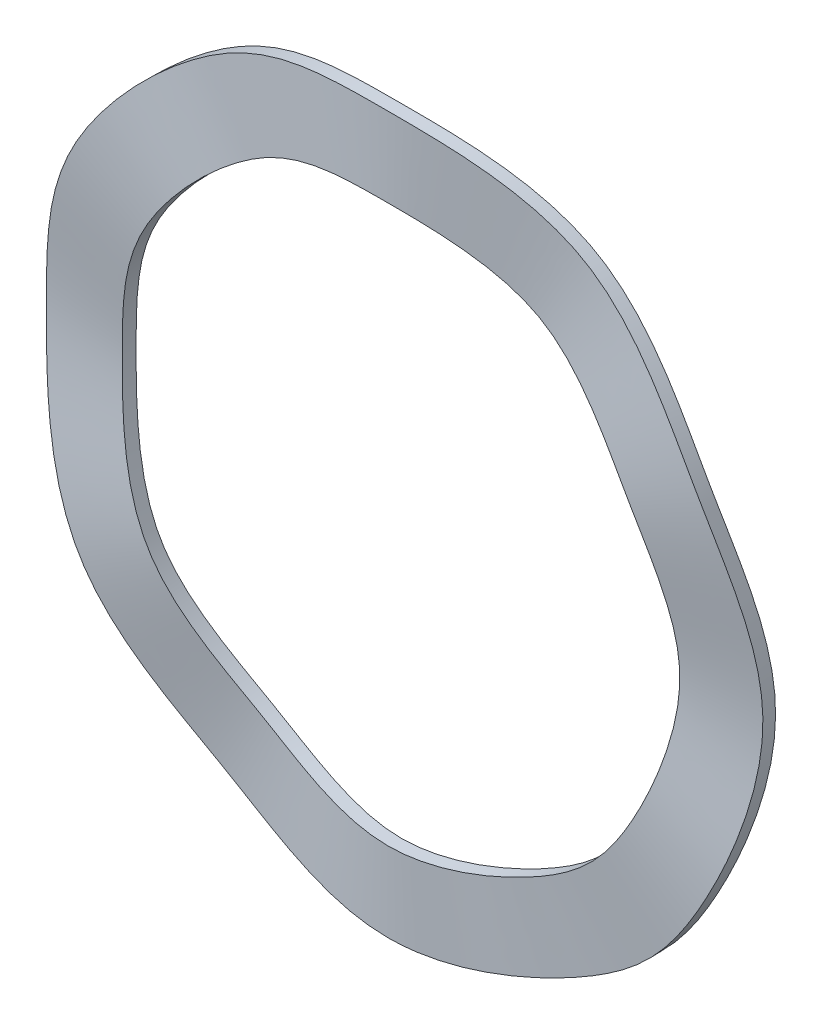
ISO-10303-21;
HEADER;
FILE_DESCRIPTION(('STEP AP214'),'2;1');
FILE_NAME('part.step','',(''),(''),'','','');
FILE_SCHEMA(('AUTOMOTIVE_DESIGN { 1 0 10303 214 1 1 1 1 }'));
ENDSEC;
DATA;
#1=APPLICATION_CONTEXT('core data for automotive mechanical design processes');
#2=APPLICATION_PROTOCOL_DEFINITION('international standard','automotive_design',2000,#1);
#3=PRODUCT_CONTEXT('',#1,'mechanical');
#4=PRODUCT('Part','Part','',(#3));
#5=PRODUCT_RELATED_PRODUCT_CATEGORY('part','',(#4));
#6=PRODUCT_DEFINITION_FORMATION('','',#4);
#7=PRODUCT_DEFINITION_CONTEXT('part definition',#1,'design');
#8=PRODUCT_DEFINITION('design','',#6,#7);
#9=PRODUCT_DEFINITION_SHAPE('','',#8);
#10=(LENGTH_UNIT() NAMED_UNIT(*) SI_UNIT(.MILLI.,.METRE.));
#11=(NAMED_UNIT(*) PLANE_ANGLE_UNIT() SI_UNIT($,.RADIAN.));
#12=(NAMED_UNIT(*) SI_UNIT($,.STERADIAN.) SOLID_ANGLE_UNIT());
#13=UNCERTAINTY_MEASURE_WITH_UNIT(LENGTH_MEASURE(1.E-05),#10,'distance_accuracy_value','');
#14=(GEOMETRIC_REPRESENTATION_CONTEXT(3) GLOBAL_UNCERTAINTY_ASSIGNED_CONTEXT((#13)) GLOBAL_UNIT_ASSIGNED_CONTEXT((#10,
#11,#12)) REPRESENTATION_CONTEXT('',''));
#15=CARTESIAN_POINT('',(0.,0.,0.));
#16=DIRECTION('',(0.,0.,1.));
#17=DIRECTION('',(1.,0.,0.));
#18=AXIS2_PLACEMENT_3D('',#15,#16,#17);
#19=CARTESIAN_POINT('',(0.,-13.5,0.350000000000003));
#20=CARTESIAN_POINT('',(-2.31317289138842,-13.5,0.350000000000072));
#21=CARTESIAN_POINT('',(-4.66289318457445,-12.882724188606,-0.272301408901748));
#22=CARTESIAN_POINT('',(-8.82531983480047,-10.4795460642622,-0.272301373732881));
#23=CARTESIAN_POINT('',(-10.5347690255698,-8.75329584756202,0.350051052372541));
#24=CARTESIAN_POINT('',(-12.8479611023498,-4.74672968618007,0.350051095639847));
#25=CARTESIAN_POINT('',(-13.4882408331322,-2.40317431504147,-0.272251517641625));
#26=CARTESIAN_POINT('',(-13.488240829194,2.4031743150418,-0.272251524719741));
#27=CARTESIAN_POINT('',(-12.8479611007759,4.74672968527651,0.35005109201583));
#28=CARTESIAN_POINT('',(-10.5347690271433,8.75329584846629,0.350051055996531));
#29=CARTESIAN_POINT('',(-8.82531983578861,10.4795460659718,-0.272301370196654));
#30=CARTESIAN_POINT('',(-4.66289318358569,12.8827241868967,-0.272301412437975));
#31=CARTESIAN_POINT('',(-2.31317849028789,13.4999999981824,0.349999996378275));
#32=CARTESIAN_POINT('',(2.3131784902875,13.5000000018176,0.350000003621759));
#33=CARTESIAN_POINT('',(4.66289318457464,12.8827241886086,-0.272301408902137));
#34=CARTESIAN_POINT('',(8.82531983479983,10.4795460642598,-0.272301373732492));
#35=CARTESIAN_POINT('',(10.5347690255751,8.75329584755968,0.350051052374428));
#36=CARTESIAN_POINT('',(12.8479611023448,4.74672968618188,0.35005109563796));
#37=CARTESIAN_POINT('',(13.4882408331361,2.40317431503527,-0.272251517642486));
#38=CARTESIAN_POINT('',(13.48824082919,-2.40317431503662,-0.272251524718881));
#39=CARTESIAN_POINT('',(12.8479611007803,-4.74672968527711,0.350051092016329));
#40=CARTESIAN_POINT('',(10.5347690271385,-8.75329584846648,0.350051055996059));
#41=CARTESIAN_POINT('',(8.82531983578968,-10.4795460659696,-0.272301370194933));
#42=CARTESIAN_POINT('',(4.66289318358393,-12.8827241868993,-0.272301412439696));
#43=CARTESIAN_POINT('',(2.31317289138833,-13.5,0.349999999999934));
#44=CARTESIAN_POINT('',(0.,-13.5,0.350000000000003));
#45=CARTESIAN_POINT('',(0.,-10.5,0.350000000000003));
#46=CARTESIAN_POINT('',(-1.77727450652617,-10.5,0.350000000000045));
#47=CARTESIAN_POINT('',(-3.64871314917526,-10.0076863447894,-0.136965869132921));
#48=CARTESIAN_POINT('',(-6.84255403804092,-8.16372145924832,-0.136966049852583));
#49=CARTESIAN_POINT('',(-8.20466639914356,-6.78915201465728,0.349744745948899));
#50=CARTESIAN_POINT('',(-9.98191133317683,-3.71087353473544,0.349744529639706));
#51=CARTESIAN_POINT('',(-10.4912811917381,-1.84401258476975,-0.137222232478723));
#52=CARTESIAN_POINT('',(-10.4912811897553,1.84401258477,-0.137222196130909));
#53=CARTESIAN_POINT('',(-9.98191133159904,3.7108735338318,0.349744547749997));
#54=CARTESIAN_POINT('',(-8.20466640072104,6.78915201556146,0.349744727838608));
#55=CARTESIAN_POINT('',(-6.84255403853441,8.16372146011204,-0.136966068027405));
#56=CARTESIAN_POINT('',(-3.6487131486813,10.007686343926,-0.136965850958098));
#57=CARTESIAN_POINT('',(-1.77728538317083,10.4999999981804,0.350000018113));
#58=CARTESIAN_POINT('',(1.77728538317053,10.5000000018196,0.349999981887034));
#59=CARTESIAN_POINT('',(3.64871314918121,10.0076863447893,-0.13696586913417));
#60=CARTESIAN_POINT('',(6.84255403803462,8.1637214592486,-0.136966049851306));
#61=CARTESIAN_POINT('',(8.20466639914961,6.78915201465216,0.34974474595062));
#62=CARTESIAN_POINT('',(9.981911333171,3.71087353474016,0.349744529637985));
#63=CARTESIAN_POINT('',(10.4912811917421,1.84401258476812,-0.137222232479112));
#64=CARTESIAN_POINT('',(10.4912811897513,-1.84401258476917,-0.137222196130521));
#65=CARTESIAN_POINT('',(9.98191133160665,-3.71087353383022,0.349744547752384));
#66=CARTESIAN_POINT('',(8.20466640071307,-6.78915201556366,0.349744727836221));
#67=CARTESIAN_POINT('',(6.84255403853381,-8.16372146011046,-0.136966068026295));
#68=CARTESIAN_POINT('',(3.64871314868137,-10.0076863439278,-0.136965850959209));
#69=CARTESIAN_POINT('',(1.7772745065261,-10.5,0.349999999999961));
#70=CARTESIAN_POINT('',(0.,-10.5,0.350000000000003));
#71=B_SPLINE_SURFACE_WITH_KNOTS('',1,3,((#19,#20,#21,#22,#23,#24,#25,#26,#27,#28,#29,#30,#31,
#32,#33,#34,#35,#36,#37,#38,#39,#40,#41,#42,#43,#44),(#45,#46,#47,#48,#49,#50,#51,#52,#53,#54,
#55,#56,#57,#58,#59,#60,#61,#62,#63,#64,#65,#66,#67,#68,#69,#70)),.UNSPECIFIED.,.F.,.T.,.F.,(2,
2),(4,2,2,2,2,2,2,2,2,2,2,2,4),(0.,1.),(0.,0.0833333333333341,0.166666666666665,
0.249999999999998,0.33333333333333,0.416666666666663,0.499999999999992,0.583333333333328,
0.66666666666667,0.750000000000002,0.833333333333335,0.916666666666669,1.),.UNSPECIFIED.);
#72=CARTESIAN_POINT('',(0.,-13.5,0.350000000000003));
#73=CARTESIAN_POINT('',(-2.31317289138842,-13.5,0.350000000000072));
#74=CARTESIAN_POINT('',(-4.66289318457445,-12.882724188606,-0.272301408901748));
#75=CARTESIAN_POINT('',(-8.82531983480047,-10.4795460642622,-0.272301373732881));
#76=CARTESIAN_POINT('',(-10.5347690255698,-8.75329584756202,0.350051052372541));
#77=CARTESIAN_POINT('',(-12.8479611023498,-4.74672968618007,0.350051095639847));
#78=CARTESIAN_POINT('',(-13.4882408331322,-2.40317431504147,-0.272251517641625));
#79=CARTESIAN_POINT('',(-13.488240829194,2.4031743150418,-0.272251524719741));
#80=CARTESIAN_POINT('',(-12.8479611007759,4.74672968527651,0.35005109201583));
#81=CARTESIAN_POINT('',(-10.5347690271433,8.75329584846629,0.350051055996531));
#82=CARTESIAN_POINT('',(-8.82531983578861,10.4795460659718,-0.272301370196654));
#83=CARTESIAN_POINT('',(-4.66289318358569,12.8827241868967,-0.272301412437975));
#84=CARTESIAN_POINT('',(-2.31317849028789,13.4999999981824,0.349999996378275));
#85=CARTESIAN_POINT('',(2.3131784902875,13.5000000018176,0.350000003621759));
#86=CARTESIAN_POINT('',(4.66289318457464,12.8827241886086,-0.272301408902137));
#87=CARTESIAN_POINT('',(8.82531983479983,10.4795460642598,-0.272301373732492));
#88=CARTESIAN_POINT('',(10.5347690255751,8.75329584755968,0.350051052374428));
#89=CARTESIAN_POINT('',(12.8479611023448,4.74672968618188,0.35005109563796));
#90=CARTESIAN_POINT('',(13.4882408331361,2.40317431503527,-0.272251517642486));
#91=CARTESIAN_POINT('',(13.48824082919,-2.40317431503662,-0.272251524718881));
#92=CARTESIAN_POINT('',(12.8479611007803,-4.74672968527711,0.350051092016329));
#93=CARTESIAN_POINT('',(10.5347690271385,-8.75329584846648,0.350051055996059));
#94=CARTESIAN_POINT('',(8.82531983578968,-10.4795460659696,-0.272301370194933));
#95=CARTESIAN_POINT('',(4.66289318358393,-12.8827241868993,-0.272301412439696));
#96=CARTESIAN_POINT('',(2.31317289138833,-13.5,0.349999999999934));
#97=CARTESIAN_POINT('',(0.,-13.5,0.350000000000003));
#98=B_SPLINE_CURVE_WITH_KNOTS('',3,(#72,#73,#74,#75,#76,#77,#78,#79,#80,#81,#82,#83,#84,#85,#86,
#87,#88,#89,#90,#91,#92,#93,#94,#95,#96,#97),.UNSPECIFIED.,.T.,.F.,(4,2,2,2,2,2,2,2,2,2,2,2,4),
(0.,0.0833333333333341,0.166666666666665,0.249999999999998,0.33333333333333,0.416666666666663,
0.499999999999992,0.583333333333328,0.66666666666667,0.750000000000002,0.833333333333335,
0.916666666666669,1.),.UNSPECIFIED.);
#99=CARTESIAN_POINT('',(0.,-13.5,0.350000000000003));
#100=VERTEX_POINT('',#99);
#101=EDGE_CURVE('E21',#100,#100,#98,.T.);
#102=CARTESIAN_POINT('',(0.,-10.5,0.350000000000003));
#103=CARTESIAN_POINT('',(-1.77727450652617,-10.5,0.350000000000045));
#104=CARTESIAN_POINT('',(-3.64871314917526,-10.0076863447894,-0.136965869132921));
#105=CARTESIAN_POINT('',(-6.84255403804092,-8.16372145924832,-0.136966049852583));
#106=CARTESIAN_POINT('',(-8.20466639914356,-6.78915201465728,0.349744745948899));
#107=CARTESIAN_POINT('',(-9.98191133317683,-3.71087353473544,0.349744529639706));
#108=CARTESIAN_POINT('',(-10.4912811917381,-1.84401258476975,-0.137222232478723));
#109=CARTESIAN_POINT('',(-10.4912811897553,1.84401258477,-0.137222196130909));
#110=CARTESIAN_POINT('',(-9.98191133159904,3.7108735338318,0.349744547749997));
#111=CARTESIAN_POINT('',(-8.20466640072104,6.78915201556146,0.349744727838608));
#112=CARTESIAN_POINT('',(-6.84255403853441,8.16372146011204,-0.136966068027405));
#113=CARTESIAN_POINT('',(-3.6487131486813,10.007686343926,-0.136965850958098));
#114=CARTESIAN_POINT('',(-1.77728538317083,10.4999999981804,0.350000018113));
#115=CARTESIAN_POINT('',(1.77728538317053,10.5000000018196,0.349999981887034));
#116=CARTESIAN_POINT('',(3.64871314918121,10.0076863447893,-0.13696586913417));
#117=CARTESIAN_POINT('',(6.84255403803462,8.1637214592486,-0.136966049851306));
#118=CARTESIAN_POINT('',(8.20466639914961,6.78915201465216,0.34974474595062));
#119=CARTESIAN_POINT('',(9.981911333171,3.71087353474016,0.349744529637985));
#120=CARTESIAN_POINT('',(10.4912811917421,1.84401258476812,-0.137222232479112));
#121=CARTESIAN_POINT('',(10.4912811897513,-1.84401258476917,-0.137222196130521));
#122=CARTESIAN_POINT('',(9.98191133160665,-3.71087353383022,0.349744547752384));
#123=CARTESIAN_POINT('',(8.20466640071307,-6.78915201556366,0.349744727836221));
#124=CARTESIAN_POINT('',(6.84255403853381,-8.16372146011046,-0.136966068026295));
#125=CARTESIAN_POINT('',(3.64871314868137,-10.0076863439278,-0.136965850959209));
#126=CARTESIAN_POINT('',(1.7772745065261,-10.5,0.349999999999961));
#127=CARTESIAN_POINT('',(0.,-10.5,0.350000000000003));
#128=B_SPLINE_CURVE_WITH_KNOTS('',3,(#102,#103,#104,#105,#106,#107,#108,#109,#110,#111,#112,
#113,#114,#115,#116,#117,#118,#119,#120,#121,#122,#123,#124,#125,#126,#127),.UNSPECIFIED.,.T.,
.F.,(4,2,2,2,2,2,2,2,2,2,2,2,4),(0.,0.0833333333333341,0.166666666666665,0.249999999999998,
0.33333333333333,0.416666666666663,0.499999999999992,0.583333333333328,0.66666666666667,
0.750000000000002,0.833333333333335,0.916666666666669,1.),.UNSPECIFIED.);
#129=CARTESIAN_POINT('',(0.,-10.5,0.350000000000003));
#130=VERTEX_POINT('',#129);
#131=EDGE_CURVE('E32',#130,#130,#128,.F.);
#132=ORIENTED_EDGE('',*,*,#101,.T.);
#133=EDGE_LOOP('',(#132));
#134=FACE_BOUND('',#133,.T.);
#135=ORIENTED_EDGE('',*,*,#131,.T.);
#136=EDGE_LOOP('',(#135));
#137=FACE_BOUND('',#136,.T.);
#138=ADVANCED_FACE('F15',(#134,#137),#71,.F.);
#139=CARTESIAN_POINT('',(0.,-13.5,0.850000000000004));
#140=CARTESIAN_POINT('',(-2.40135828842795,-13.5,0.850000000000073));
#141=CARTESIAN_POINT('',(-4.7469636007399,-12.8602314479732,0.227189562312297));
#142=CARTESIAN_POINT('',(-8.76380532393913,-10.5411067788923,0.227189599105948));
#143=CARTESIAN_POINT('',(-10.4906431580522,-8.82962198989097,0.85005104976657));
#144=CARTESIAN_POINT('',(-12.8919985093527,-4.6703524711491,0.850051093028964));
#145=CARTESIAN_POINT('',(-13.5107457139939,-2.31911130888308,0.227241755924312));
#146=CARTESIAN_POINT('',(-13.5107457172908,2.31911130888345,0.227241748519791));
#147=CARTESIAN_POINT('',(-12.8919985109144,4.67035247205632,0.850051089405501));
#148=CARTESIAN_POINT('',(-10.49064315649,8.82962198898452,0.850051053390033));
#149=CARTESIAN_POINT('',(-8.76380532311848,10.5411067774683,0.227189602805322));
#150=CARTESIAN_POINT('',(-4.74696360155989,12.8602314493976,0.227189558612895));
#151=CARTESIAN_POINT('',(-2.40135092590556,13.5000000018058,0.849999996378387));
#152=CARTESIAN_POINT('',(2.4013509259052,13.4999999981942,0.85000000362162));
#153=CARTESIAN_POINT('',(4.74696360073879,12.860231447976,0.22718956231188));
#154=CARTESIAN_POINT('',(8.7638053239398,10.5411067788897,0.227189599106364));
#155=CARTESIAN_POINT('',(10.4906431580557,8.82962198988927,0.850051049768291));
#156=CARTESIAN_POINT('',(12.8919985093494,4.67035247115027,0.850051093027243));
#157=CARTESIAN_POINT('',(13.5107457139979,2.31911130887703,0.22724175592323));
#158=CARTESIAN_POINT('',(13.5107457172869,-2.31911130887841,0.227241748520873));
#159=CARTESIAN_POINT('',(12.8919985109225,-4.67035247205628,0.85005108940614));
#160=CARTESIAN_POINT('',(10.4906431564815,-8.82962198898535,0.850051053389422));
#161=CARTESIAN_POINT('',(8.76380532311987,-10.5411067774659,0.227189602807376));
#162=CARTESIAN_POINT('',(4.7469636015578,-12.8602314494004,0.227189558610869));
#163=CARTESIAN_POINT('',(2.40135828842785,-13.5,0.849999999999934));
#164=CARTESIAN_POINT('',(0.,-13.5,0.850000000000004));
#165=CARTESIAN_POINT('',(0.,-13.5,0.350000000000003));
#166=CARTESIAN_POINT('',(-2.31317289138842,-13.5,0.350000000000072));
#167=CARTESIAN_POINT('',(-4.66289318457445,-12.882724188606,-0.272301408901748));
#168=CARTESIAN_POINT('',(-8.82531983480047,-10.4795460642622,-0.272301373732881));
#169=CARTESIAN_POINT('',(-10.5347690255698,-8.75329584756202,0.350051052372541));
#170=CARTESIAN_POINT('',(-12.8479611023498,-4.74672968618007,0.350051095639847));
#171=CARTESIAN_POINT('',(-13.4882408331322,-2.40317431504147,-0.272251517641625));
#172=CARTESIAN_POINT('',(-13.488240829194,2.4031743150418,-0.272251524719741));
#173=CARTESIAN_POINT('',(-12.8479611007759,4.74672968527651,0.35005109201583));
#174=CARTESIAN_POINT('',(-10.5347690271433,8.75329584846629,0.350051055996531));
#175=CARTESIAN_POINT('',(-8.82531983578861,10.4795460659718,-0.272301370196654));
#176=CARTESIAN_POINT('',(-4.66289318358569,12.8827241868967,-0.272301412437975));
#177=CARTESIAN_POINT('',(-2.31317849028789,13.4999999981824,0.349999996378275));
#178=CARTESIAN_POINT('',(2.3131784902875,13.5000000018176,0.350000003621759));
#179=CARTESIAN_POINT('',(4.66289318457464,12.8827241886086,-0.272301408902137));
#180=CARTESIAN_POINT('',(8.82531983479983,10.4795460642598,-0.272301373732492));
#181=CARTESIAN_POINT('',(10.5347690255751,8.75329584755968,0.350051052374428));
#182=CARTESIAN_POINT('',(12.8479611023448,4.74672968618188,0.35005109563796));
#183=CARTESIAN_POINT('',(13.4882408331361,2.40317431503527,-0.272251517642486));
#184=CARTESIAN_POINT('',(13.48824082919,-2.40317431503662,-0.272251524718881));
#185=CARTESIAN_POINT('',(12.8479611007803,-4.74672968527711,0.350051092016329));
#186=CARTESIAN_POINT('',(10.5347690271385,-8.75329584846648,0.350051055996059));
#187=CARTESIAN_POINT('',(8.82531983578968,-10.4795460659696,-0.272301370194933));
#188=CARTESIAN_POINT('',(4.66289318358393,-12.8827241868993,-0.272301412439696));
#189=CARTESIAN_POINT('',(2.31317289138833,-13.5,0.349999999999934));
#190=CARTESIAN_POINT('',(0.,-13.5,0.350000000000003));
#191=B_SPLINE_SURFACE_WITH_KNOTS('',1,3,((#139,#140,#141,#142,#143,#144,#145,#146,#147,#148,
#149,#150,#151,#152,#153,#154,#155,#156,#157,#158,#159,#160,#161,#162,#163,#164),(#165,#166,
#167,#168,#169,#170,#171,#172,#173,#174,#175,#176,#177,#178,#179,#180,#181,#182,#183,#184,#185,
#186,#187,#188,#189,#190)),.UNSPECIFIED.,.F.,.T.,.F.,(2,2),(4,2,2,2,2,2,2,2,2,2,2,2,4),(0.,1.),
(0.,0.0833333333333341,0.166666666666665,0.249999999999998,0.33333333333333,0.416666666666663,
0.499999999999992,0.583333333333328,0.66666666666667,0.750000000000002,0.833333333333335,
0.916666666666669,1.),.UNSPECIFIED.);
#192=CARTESIAN_POINT('',(0.,-13.5,0.850000000000004));
#193=CARTESIAN_POINT('',(-2.40135828842795,-13.5,0.850000000000073));
#194=CARTESIAN_POINT('',(-4.7469636007399,-12.8602314479732,0.227189562312297));
#195=CARTESIAN_POINT('',(-8.76380532393913,-10.5411067788923,0.227189599105948));
#196=CARTESIAN_POINT('',(-10.4906431580522,-8.82962198989097,0.85005104976657));
#197=CARTESIAN_POINT('',(-12.8919985093527,-4.6703524711491,0.850051093028964));
#198=CARTESIAN_POINT('',(-13.5107457139939,-2.31911130888308,0.227241755924312));
#199=CARTESIAN_POINT('',(-13.5107457172908,2.31911130888345,0.227241748519791));
#200=CARTESIAN_POINT('',(-12.8919985109144,4.67035247205632,0.850051089405501));
#201=CARTESIAN_POINT('',(-10.49064315649,8.82962198898452,0.850051053390033));
#202=CARTESIAN_POINT('',(-8.76380532311848,10.5411067774683,0.227189602805322));
#203=CARTESIAN_POINT('',(-4.74696360155989,12.8602314493976,0.227189558612895));
#204=CARTESIAN_POINT('',(-2.40135092590556,13.5000000018058,0.849999996378387));
#205=CARTESIAN_POINT('',(2.4013509259052,13.4999999981942,0.85000000362162));
#206=CARTESIAN_POINT('',(4.74696360073879,12.860231447976,0.22718956231188));
#207=CARTESIAN_POINT('',(8.7638053239398,10.5411067788897,0.227189599106364));
#208=CARTESIAN_POINT('',(10.4906431580557,8.82962198988927,0.850051049768291));
#209=CARTESIAN_POINT('',(12.8919985093494,4.67035247115027,0.850051093027243));
#210=CARTESIAN_POINT('',(13.5107457139979,2.31911130887703,0.22724175592323));
#211=CARTESIAN_POINT('',(13.5107457172869,-2.31911130887841,0.227241748520873));
#212=CARTESIAN_POINT('',(12.8919985109225,-4.67035247205628,0.85005108940614));
#213=CARTESIAN_POINT('',(10.4906431564815,-8.82962198898535,0.850051053389422));
#214=CARTESIAN_POINT('',(8.76380532311987,-10.5411067774659,0.227189602807376));
#215=CARTESIAN_POINT('',(4.7469636015578,-12.8602314494004,0.227189558610869));
#216=CARTESIAN_POINT('',(2.40135828842785,-13.5,0.849999999999934));
#217=CARTESIAN_POINT('',(0.,-13.5,0.850000000000004));
#218=B_SPLINE_CURVE_WITH_KNOTS('',3,(#192,#193,#194,#195,#196,#197,#198,#199,#200,#201,#202,
#203,#204,#205,#206,#207,#208,#209,#210,#211,#212,#213,#214,#215,#216,#217),.UNSPECIFIED.,.T.,
.F.,(4,2,2,2,2,2,2,2,2,2,2,2,4),(0.,0.0833333333333341,0.166666666666665,0.249999999999998,
0.33333333333333,0.416666666666663,0.499999999999992,0.583333333333328,0.66666666666667,
0.750000000000002,0.833333333333335,0.916666666666669,1.),.UNSPECIFIED.);
#219=CARTESIAN_POINT('',(0.,-13.5,0.850000000000004));
#220=VERTEX_POINT('',#219);
#221=EDGE_CURVE('E27',#220,#220,#218,.T.);
#222=ORIENTED_EDGE('',*,*,#221,.T.);
#223=EDGE_LOOP('',(#222));
#224=FACE_BOUND('',#223,.T.);
#225=ORIENTED_EDGE('',*,*,#101,.F.);
#226=EDGE_LOOP('',(#225));
#227=FACE_BOUND('',#226,.T.);
#228=ADVANCED_FACE('F56',(#224,#227),#191,.F.);
#229=CARTESIAN_POINT('',(0.,-10.5,0.350000000000003));
#230=CARTESIAN_POINT('',(-1.77727450652617,-10.5,0.350000000000045));
#231=CARTESIAN_POINT('',(-3.64871314917526,-10.0076863447894,-0.136965869132921));
#232=CARTESIAN_POINT('',(-6.84255403804092,-8.16372145924832,-0.136966049852583));
#233=CARTESIAN_POINT('',(-8.20466639914356,-6.78915201465728,0.349744745948899));
#234=CARTESIAN_POINT('',(-9.98191133317683,-3.71087353473544,0.349744529639706));
#235=CARTESIAN_POINT('',(-10.4912811917381,-1.84401258476975,-0.137222232478723));
#236=CARTESIAN_POINT('',(-10.4912811897553,1.84401258477,-0.137222196130909));
#237=CARTESIAN_POINT('',(-9.98191133159904,3.7108735338318,0.349744547749997));
#238=CARTESIAN_POINT('',(-8.20466640072104,6.78915201556146,0.349744727838608));
#239=CARTESIAN_POINT('',(-6.84255403853441,8.16372146011204,-0.136966068027405));
#240=CARTESIAN_POINT('',(-3.6487131486813,10.007686343926,-0.136965850958098));
#241=CARTESIAN_POINT('',(-1.77728538317083,10.4999999981804,0.350000018113));
#242=CARTESIAN_POINT('',(1.77728538317053,10.5000000018196,0.349999981887034));
#243=CARTESIAN_POINT('',(3.64871314918121,10.0076863447893,-0.13696586913417));
#244=CARTESIAN_POINT('',(6.84255403803462,8.1637214592486,-0.136966049851306));
#245=CARTESIAN_POINT('',(8.20466639914961,6.78915201465216,0.34974474595062));
#246=CARTESIAN_POINT('',(9.981911333171,3.71087353474016,0.349744529637985));
#247=CARTESIAN_POINT('',(10.4912811917421,1.84401258476812,-0.137222232479112));
#248=CARTESIAN_POINT('',(10.4912811897513,-1.84401258476917,-0.137222196130521));
#249=CARTESIAN_POINT('',(9.98191133160665,-3.71087353383022,0.349744547752384));
#250=CARTESIAN_POINT('',(8.20466640071307,-6.78915201556366,0.349744727836221));
#251=CARTESIAN_POINT('',(6.84255403853381,-8.16372146011046,-0.136966068026295));
#252=CARTESIAN_POINT('',(3.64871314868137,-10.0076863439278,-0.136965850959209));
#253=CARTESIAN_POINT('',(1.7772745065261,-10.5,0.349999999999961));
#254=CARTESIAN_POINT('',(0.,-10.5,0.350000000000003));
#255=CARTESIAN_POINT('',(0.,-10.5,0.850000000000004));
#256=CARTESIAN_POINT('',(-1.8654599035657,-10.5,0.850000000000045));
#257=CARTESIAN_POINT('',(-3.73278356534071,-9.98519360415666,0.362525102081068));
#258=CARTESIAN_POINT('',(-6.78103952717959,-8.22528217387845,0.362524922986329));
#259=CARTESIAN_POINT('',(-8.16054053162595,-6.86547815698623,0.849744743342873));
#260=CARTESIAN_POINT('',(-10.0259487401797,-3.63449631970448,0.849744527028878));
#261=CARTESIAN_POINT('',(-10.5137860725999,-1.75994957861137,0.362271041087103));
#262=CARTESIAN_POINT('',(-10.5137860778521,1.75994957861165,0.362271077108733));
#263=CARTESIAN_POINT('',(-10.0259487417375,3.63449632061161,0.849744545139669));
#264=CARTESIAN_POINT('',(-8.1605405300678,6.86547815607969,0.84974472523211));
#265=CARTESIAN_POINT('',(-6.78103952586427,8.22528217160855,0.362524904974515));
#266=CARTESIAN_POINT('',(-3.7327835666555,9.98519360642687,0.362525120092855));
#267=CARTESIAN_POINT('',(-1.8654578187885,10.5000000018039,0.850000018113112));
#268=CARTESIAN_POINT('',(1.86545781878822,10.4999999981962,0.849999981886895));
#269=CARTESIAN_POINT('',(3.73278356534536,9.98519360415678,0.362525102079958));
#270=CARTESIAN_POINT('',(6.78103952717459,8.22528217387853,0.362524922987439));
#271=CARTESIAN_POINT('',(8.16054053163023,6.86547815698175,0.849744743344483));
#272=CARTESIAN_POINT('',(10.0259487401757,3.63449631970855,0.849744527027296));
#273=CARTESIAN_POINT('',(10.5137860726038,1.75994957860988,0.362271041086604));
#274=CARTESIAN_POINT('',(10.5137860778482,-1.75994957861096,0.362271077109233));
#275=CARTESIAN_POINT('',(10.0259487417489,-3.63449632060939,0.849744545142112));
#276=CARTESIAN_POINT('',(8.1605405300561,-6.86547815608253,0.84974472522964));
#277=CARTESIAN_POINT('',(6.78103952586401,-8.22528217160678,0.36252490497593));
#278=CARTESIAN_POINT('',(3.73278356665524,-9.98519360642895,0.362525120091439));
#279=CARTESIAN_POINT('',(1.86545990356562,-10.5,0.849999999999962));
#280=CARTESIAN_POINT('',(0.,-10.5,0.850000000000004));
#281=B_SPLINE_SURFACE_WITH_KNOTS('',1,3,((#229,#230,#231,#232,#233,#234,#235,#236,#237,#238,
#239,#240,#241,#242,#243,#244,#245,#246,#247,#248,#249,#250,#251,#252,#253,#254),(#255,#256,
#257,#258,#259,#260,#261,#262,#263,#264,#265,#266,#267,#268,#269,#270,#271,#272,#273,#274,#275,
#276,#277,#278,#279,#280)),.UNSPECIFIED.,.F.,.T.,.F.,(2,2),(4,2,2,2,2,2,2,2,2,2,2,2,4),(0.,1.),
(0.,0.0833333333333341,0.166666666666665,0.249999999999998,0.33333333333333,0.416666666666663,
0.499999999999992,0.583333333333328,0.66666666666667,0.750000000000002,0.833333333333335,
0.916666666666669,1.),.UNSPECIFIED.);
#282=CARTESIAN_POINT('',(0.,-10.5,0.850000000000004));
#283=CARTESIAN_POINT('',(-1.8654599035657,-10.5,0.850000000000045));
#284=CARTESIAN_POINT('',(-3.73278356534071,-9.98519360415666,0.362525102081068));
#285=CARTESIAN_POINT('',(-6.78103952717959,-8.22528217387845,0.362524922986329));
#286=CARTESIAN_POINT('',(-8.16054053162595,-6.86547815698623,0.849744743342873));
#287=CARTESIAN_POINT('',(-10.0259487401797,-3.63449631970448,0.849744527028878));
#288=CARTESIAN_POINT('',(-10.5137860725999,-1.75994957861137,0.362271041087103));
#289=CARTESIAN_POINT('',(-10.5137860778521,1.75994957861165,0.362271077108733));
#290=CARTESIAN_POINT('',(-10.0259487417375,3.63449632061161,0.849744545139669));
#291=CARTESIAN_POINT('',(-8.1605405300678,6.86547815607969,0.84974472523211));
#292=CARTESIAN_POINT('',(-6.78103952586427,8.22528217160855,0.362524904974515));
#293=CARTESIAN_POINT('',(-3.7327835666555,9.98519360642687,0.362525120092855));
#294=CARTESIAN_POINT('',(-1.8654578187885,10.5000000018039,0.850000018113112));
#295=CARTESIAN_POINT('',(1.86545781878822,10.4999999981962,0.849999981886895));
#296=CARTESIAN_POINT('',(3.73278356534536,9.98519360415678,0.362525102079958));
#297=CARTESIAN_POINT('',(6.78103952717459,8.22528217387853,0.362524922987439));
#298=CARTESIAN_POINT('',(8.16054053163023,6.86547815698175,0.849744743344483));
#299=CARTESIAN_POINT('',(10.0259487401757,3.63449631970855,0.849744527027296));
#300=CARTESIAN_POINT('',(10.5137860726038,1.75994957860988,0.362271041086604));
#301=CARTESIAN_POINT('',(10.5137860778482,-1.75994957861096,0.362271077109233));
#302=CARTESIAN_POINT('',(10.0259487417489,-3.63449632060939,0.849744545142112));
#303=CARTESIAN_POINT('',(8.1605405300561,-6.86547815608253,0.84974472522964));
#304=CARTESIAN_POINT('',(6.78103952586401,-8.22528217160678,0.36252490497593));
#305=CARTESIAN_POINT('',(3.73278356665524,-9.98519360642895,0.362525120091439));
#306=CARTESIAN_POINT('',(1.86545990356562,-10.5,0.849999999999962));
#307=CARTESIAN_POINT('',(0.,-10.5,0.850000000000004));
#308=B_SPLINE_CURVE_WITH_KNOTS('',3,(#282,#283,#284,#285,#286,#287,#288,#289,#290,#291,#292,
#293,#294,#295,#296,#297,#298,#299,#300,#301,#302,#303,#304,#305,#306,#307),.UNSPECIFIED.,.T.,
.F.,(4,2,2,2,2,2,2,2,2,2,2,2,4),(0.,0.0833333333333341,0.166666666666665,0.249999999999998,
0.33333333333333,0.416666666666663,0.499999999999992,0.583333333333328,0.66666666666667,
0.750000000000002,0.833333333333335,0.916666666666669,1.),.UNSPECIFIED.);
#309=CARTESIAN_POINT('',(0.,-10.5,0.850000000000004));
#310=VERTEX_POINT('',#309);
#311=EDGE_CURVE('E10',#310,#310,#308,.F.);
#312=ORIENTED_EDGE('',*,*,#131,.F.);
#313=EDGE_LOOP('',(#312));
#314=FACE_BOUND('',#313,.T.);
#315=ORIENTED_EDGE('',*,*,#311,.T.);
#316=EDGE_LOOP('',(#315));
#317=FACE_BOUND('',#316,.T.);
#318=ADVANCED_FACE('F58',(#314,#317),#281,.F.);
#319=CARTESIAN_POINT('',(0.,-10.5,0.850000000000004));
#320=CARTESIAN_POINT('',(-1.8654599035657,-10.5,0.850000000000045));
#321=CARTESIAN_POINT('',(-3.73278356534071,-9.98519360415666,0.362525102081068));
#322=CARTESIAN_POINT('',(-6.78103952717959,-8.22528217387845,0.362524922986329));
#323=CARTESIAN_POINT('',(-8.16054053162595,-6.86547815698623,0.849744743342873));
#324=CARTESIAN_POINT('',(-10.0259487401797,-3.63449631970448,0.849744527028878));
#325=CARTESIAN_POINT('',(-10.5137860725999,-1.75994957861137,0.362271041087103));
#326=CARTESIAN_POINT('',(-10.5137860778521,1.75994957861165,0.362271077108733));
#327=CARTESIAN_POINT('',(-10.0259487417375,3.63449632061161,0.849744545139669));
#328=CARTESIAN_POINT('',(-8.1605405300678,6.86547815607969,0.84974472523211));
#329=CARTESIAN_POINT('',(-6.78103952586427,8.22528217160855,0.362524904974515));
#330=CARTESIAN_POINT('',(-3.7327835666555,9.98519360642687,0.362525120092855));
#331=CARTESIAN_POINT('',(-1.8654578187885,10.5000000018039,0.850000018113112));
#332=CARTESIAN_POINT('',(1.86545781878822,10.4999999981962,0.849999981886895));
#333=CARTESIAN_POINT('',(3.73278356534536,9.98519360415678,0.362525102079958));
#334=CARTESIAN_POINT('',(6.78103952717459,8.22528217387853,0.362524922987439));
#335=CARTESIAN_POINT('',(8.16054053163023,6.86547815698175,0.849744743344483));
#336=CARTESIAN_POINT('',(10.0259487401757,3.63449631970855,0.849744527027296));
#337=CARTESIAN_POINT('',(10.5137860726038,1.75994957860988,0.362271041086604));
#338=CARTESIAN_POINT('',(10.5137860778482,-1.75994957861096,0.362271077109233));
#339=CARTESIAN_POINT('',(10.0259487417489,-3.63449632060939,0.849744545142112));
#340=CARTESIAN_POINT('',(8.1605405300561,-6.86547815608253,0.84974472522964));
#341=CARTESIAN_POINT('',(6.78103952586401,-8.22528217160678,0.36252490497593));
#342=CARTESIAN_POINT('',(3.73278356665524,-9.98519360642895,0.362525120091439));
#343=CARTESIAN_POINT('',(1.86545990356562,-10.5,0.849999999999962));
#344=CARTESIAN_POINT('',(0.,-10.5,0.850000000000004));
#345=CARTESIAN_POINT('',(0.,-13.5,0.850000000000004));
#346=CARTESIAN_POINT('',(-2.40135828842795,-13.5,0.850000000000073));
#347=CARTESIAN_POINT('',(-4.7469636007399,-12.8602314479732,0.227189562312297));
#348=CARTESIAN_POINT('',(-8.76380532393913,-10.5411067788923,0.227189599105948));
#349=CARTESIAN_POINT('',(-10.4906431580522,-8.82962198989097,0.85005104976657));
#350=CARTESIAN_POINT('',(-12.8919985093527,-4.6703524711491,0.850051093028964));
#351=CARTESIAN_POINT('',(-13.5107457139939,-2.31911130888308,0.227241755924312));
#352=CARTESIAN_POINT('',(-13.5107457172908,2.31911130888345,0.227241748519791));
#353=CARTESIAN_POINT('',(-12.8919985109144,4.67035247205632,0.850051089405501));
#354=CARTESIAN_POINT('',(-10.49064315649,8.82962198898452,0.850051053390033));
#355=CARTESIAN_POINT('',(-8.76380532311848,10.5411067774683,0.227189602805322));
#356=CARTESIAN_POINT('',(-4.74696360155989,12.8602314493976,0.227189558612895));
#357=CARTESIAN_POINT('',(-2.40135092590556,13.5000000018058,0.849999996378387));
#358=CARTESIAN_POINT('',(2.4013509259052,13.4999999981942,0.85000000362162));
#359=CARTESIAN_POINT('',(4.74696360073879,12.860231447976,0.22718956231188));
#360=CARTESIAN_POINT('',(8.7638053239398,10.5411067788897,0.227189599106364));
#361=CARTESIAN_POINT('',(10.4906431580557,8.82962198988927,0.850051049768291));
#362=CARTESIAN_POINT('',(12.8919985093494,4.67035247115027,0.850051093027243));
#363=CARTESIAN_POINT('',(13.5107457139979,2.31911130887703,0.22724175592323));
#364=CARTESIAN_POINT('',(13.5107457172869,-2.31911130887841,0.227241748520873));
#365=CARTESIAN_POINT('',(12.8919985109225,-4.67035247205628,0.85005108940614));
#366=CARTESIAN_POINT('',(10.4906431564815,-8.82962198898535,0.850051053389422));
#367=CARTESIAN_POINT('',(8.76380532311987,-10.5411067774659,0.227189602807376));
#368=CARTESIAN_POINT('',(4.7469636015578,-12.8602314494004,0.227189558610869));
#369=CARTESIAN_POINT('',(2.40135828842785,-13.5,0.849999999999934));
#370=CARTESIAN_POINT('',(0.,-13.5,0.850000000000004));
#371=B_SPLINE_SURFACE_WITH_KNOTS('',1,3,((#319,#320,#321,#322,#323,#324,#325,#326,#327,#328,
#329,#330,#331,#332,#333,#334,#335,#336,#337,#338,#339,#340,#341,#342,#343,#344),(#345,#346,
#347,#348,#349,#350,#351,#352,#353,#354,#355,#356,#357,#358,#359,#360,#361,#362,#363,#364,#365,
#366,#367,#368,#369,#370)),.UNSPECIFIED.,.F.,.T.,.F.,(2,2),(4,2,2,2,2,2,2,2,2,2,2,2,4),(0.,1.),
(0.,0.0833333333333341,0.166666666666665,0.249999999999998,0.33333333333333,0.416666666666663,
0.499999999999992,0.583333333333328,0.66666666666667,0.750000000000002,0.833333333333335,
0.916666666666669,1.),.UNSPECIFIED.);
#372=ORIENTED_EDGE('',*,*,#311,.F.);
#373=EDGE_LOOP('',(#372));
#374=FACE_BOUND('',#373,.T.);
#375=ORIENTED_EDGE('',*,*,#221,.F.);
#376=EDGE_LOOP('',(#375));
#377=FACE_BOUND('',#376,.T.);
#378=ADVANCED_FACE('F17',(#374,#377),#371,.F.);
#379=CLOSED_SHELL('',(#138,#228,#318,#378));
#380=MANIFOLD_SOLID_BREP('B1',#379);
#381=ADVANCED_BREP_SHAPE_REPRESENTATION('',(#18,#380),#14);
#382=SHAPE_DEFINITION_REPRESENTATION(#9,#381);
ENDSEC;
END-ISO-10303-21;
